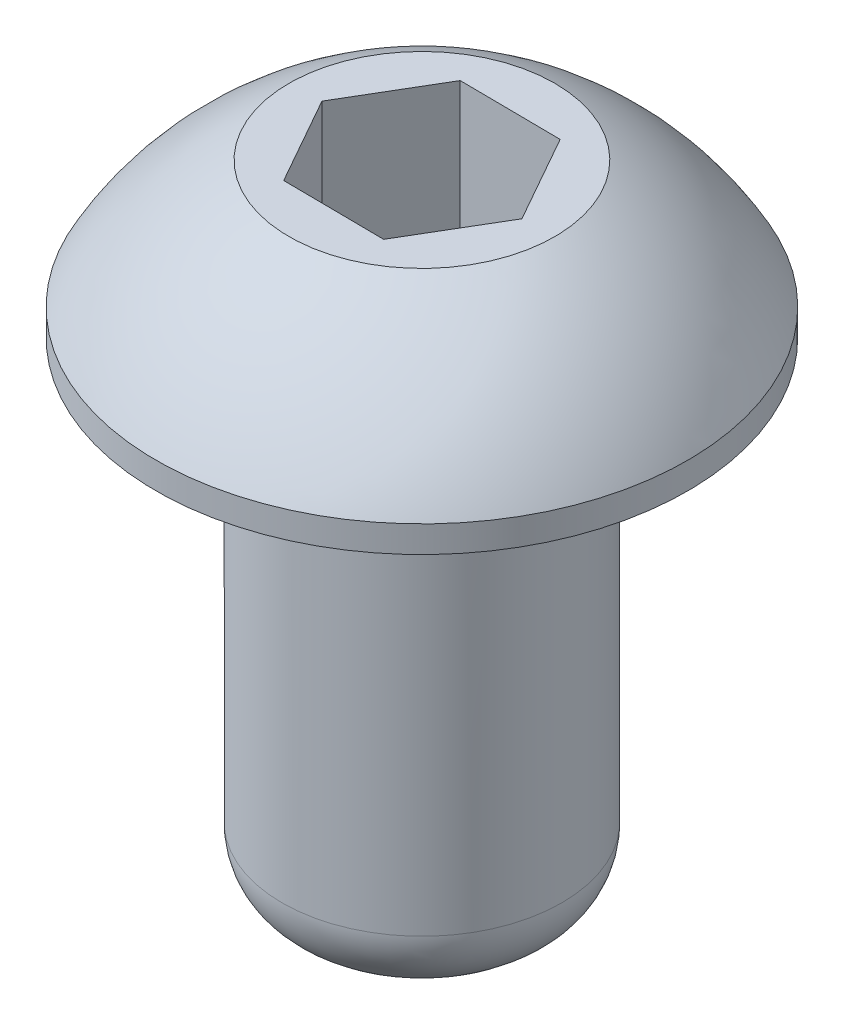
ISO-10303-21;
HEADER;
FILE_DESCRIPTION(('STEP AP214'),'2;1');
FILE_NAME('part.step','',(''),(''),'','','');
FILE_SCHEMA(('AUTOMOTIVE_DESIGN { 1 0 10303 214 1 1 1 1 }'));
ENDSEC;
DATA;
#1=APPLICATION_CONTEXT('core data for automotive mechanical design processes');
#2=APPLICATION_PROTOCOL_DEFINITION('international standard','automotive_design',2000,#1);
#3=PRODUCT_CONTEXT('',#1,'mechanical');
#4=PRODUCT('Part','Part','',(#3));
#5=PRODUCT_RELATED_PRODUCT_CATEGORY('part','',(#4));
#6=PRODUCT_DEFINITION_FORMATION('','',#4);
#7=PRODUCT_DEFINITION_CONTEXT('part definition',#1,'design');
#8=PRODUCT_DEFINITION('design','',#6,#7);
#9=PRODUCT_DEFINITION_SHAPE('','',#8);
#10=(LENGTH_UNIT() NAMED_UNIT(*) SI_UNIT(.MILLI.,.METRE.));
#11=(NAMED_UNIT(*) PLANE_ANGLE_UNIT() SI_UNIT($,.RADIAN.));
#12=(NAMED_UNIT(*) SI_UNIT($,.STERADIAN.) SOLID_ANGLE_UNIT());
#13=UNCERTAINTY_MEASURE_WITH_UNIT(LENGTH_MEASURE(1.E-05),#10,'distance_accuracy_value','');
#14=(GEOMETRIC_REPRESENTATION_CONTEXT(3) GLOBAL_UNCERTAINTY_ASSIGNED_CONTEXT((#13)) GLOBAL_UNIT_ASSIGNED_CONTEXT((#10,
#11,#12)) REPRESENTATION_CONTEXT('',''));
#15=CARTESIAN_POINT('',(0.,0.,0.));
#16=DIRECTION('',(0.,0.,1.));
#17=DIRECTION('',(1.,0.,0.));
#18=AXIS2_PLACEMENT_3D('',#15,#16,#17);
#19=CARTESIAN_POINT('',(0.,7.,0.));
#20=DIRECTION('',(0.,-1.,0.));
#21=DIRECTION('',(0.,0.,-1.));
#22=AXIS2_PLACEMENT_3D('',#19,#20,#21);
#23=CYLINDRICAL_SURFACE('',#22,2.);
#24=CARTESIAN_POINT('',(0.,6.,0.));
#25=DIRECTION('',(0.,-1.,0.));
#26=DIRECTION('',(0.,0.,-1.));
#27=AXIS2_PLACEMENT_3D('',#24,#25,#26);
#28=CIRCLE('',#27,2.);
#29=CARTESIAN_POINT('',(0.,6.,-2.));
#30=VERTEX_POINT('',#29);
#31=EDGE_CURVE('E50',#30,#30,#28,.T.);
#32=ORIENTED_EDGE('',*,*,#31,.T.);
#33=EDGE_LOOP('',(#32));
#34=FACE_BOUND('',#33,.T.);
#35=CARTESIAN_POINT('',(0.,1.,0.));
#36=DIRECTION('',(0.,1.,0.));
#37=DIRECTION('',(0.,0.,1.));
#38=AXIS2_PLACEMENT_3D('',#35,#36,#37);
#39=CIRCLE('',#38,2.);
#40=CARTESIAN_POINT('',(0.,1.,2.));
#41=VERTEX_POINT('',#40);
#42=EDGE_CURVE('E158',#41,#41,#39,.T.);
#43=ORIENTED_EDGE('',*,*,#42,.T.);
#44=EDGE_LOOP('',(#43));
#45=FACE_BOUND('',#44,.T.);
#46=ADVANCED_FACE('F39',(#34,#45),#23,.T.);
#47=CARTESIAN_POINT('',(0.,0.,0.));
#48=DIRECTION('',(0.,1.,0.));
#49=DIRECTION('',(0.,0.,1.));
#50=AXIS2_PLACEMENT_3D('',#47,#48,#49);
#51=PLANE('',#50);
#52=CARTESIAN_POINT('',(0.,0.,0.));
#53=DIRECTION('',(0.,1.,0.));
#54=DIRECTION('',(0.,0.,1.));
#55=AXIS2_PLACEMENT_3D('',#52,#53,#54);
#56=CIRCLE('',#55,1.);
#57=CARTESIAN_POINT('',(0.,0.,1.));
#58=VERTEX_POINT('',#57);
#59=EDGE_CURVE('E11',#58,#58,#56,.F.);
#60=ORIENTED_EDGE('',*,*,#59,.T.);
#61=EDGE_LOOP('',(#60));
#62=FACE_BOUND('',#61,.T.);
#63=ADVANCED_FACE('F173',(#62),#51,.F.);
#64=CARTESIAN_POINT('',(0.,7.,0.));
#65=DIRECTION('',(0.,-1.,0.));
#66=DIRECTION('',(0.,0.,-1.));
#67=AXIS2_PLACEMENT_3D('',#64,#65,#66);
#68=PLANE('',#67);
#69=CARTESIAN_POINT('',(0.,7.,0.));
#70=DIRECTION('',(0.,-1.,0.));
#71=DIRECTION('',(0.,0.,-1.));
#72=AXIS2_PLACEMENT_3D('',#69,#70,#71);
#73=CIRCLE('',#72,3.);
#74=CARTESIAN_POINT('',(0.,7.,-3.));
#75=VERTEX_POINT('',#74);
#76=EDGE_CURVE('E154',#75,#75,#73,.F.);
#77=ORIENTED_EDGE('',*,*,#76,.T.);
#78=EDGE_LOOP('',(#77));
#79=FACE_BOUND('',#78,.T.);
#80=CARTESIAN_POINT('',(0.,7.,0.));
#81=DIRECTION('',(0.,-1.,0.));
#82=DIRECTION('',(0.,0.,-1.));
#83=AXIS2_PLACEMENT_3D('',#80,#81,#82);
#84=CIRCLE('',#83,3.8);
#85=CARTESIAN_POINT('',(0.,7.,-3.8));
#86=VERTEX_POINT('',#85);
#87=EDGE_CURVE('E155',#86,#86,#84,.T.);
#88=ORIENTED_EDGE('',*,*,#87,.T.);
#89=EDGE_LOOP('',(#88));
#90=FACE_BOUND('',#89,.T.);
#91=ADVANCED_FACE('F168',(#79,#90),#68,.T.);
#92=CARTESIAN_POINT('',(0.,7.,0.));
#93=DIRECTION('',(0.,-1.,0.));
#94=DIRECTION('',(0.,0.,-1.));
#95=AXIS2_PLACEMENT_3D('',#92,#93,#94);
#96=CYLINDRICAL_SURFACE('',#95,3.8);
#97=CARTESIAN_POINT('',(0.,7.38,0.));
#98=DIRECTION('',(0.,-1.,0.));
#99=DIRECTION('',(0.,0.,-1.));
#100=AXIS2_PLACEMENT_3D('',#97,#98,#99);
#101=CIRCLE('',#100,3.8);
#102=CARTESIAN_POINT('',(0.,7.38,-3.8));
#103=VERTEX_POINT('',#102);
#104=EDGE_CURVE('E149',#103,#103,#101,.T.);
#105=ORIENTED_EDGE('',*,*,#104,.T.);
#106=EDGE_LOOP('',(#105));
#107=FACE_BOUND('',#106,.T.);
#108=ORIENTED_EDGE('',*,*,#87,.F.);
#109=EDGE_LOOP('',(#108));
#110=FACE_BOUND('',#109,.T.);
#111=ADVANCED_FACE('F175',(#107,#110),#96,.T.);
#112=CARTESIAN_POINT('',(0.,5.31849256972456,0.));
#113=DIRECTION('',(0.,-1.,0.));
#114=DIRECTION('',(0.,0.,-1.));
#115=AXIS2_PLACEMENT_3D('',#112,#113,#114);
#116=DEGENERATE_TOROIDAL_SURFACE('',#115,0.00360867205194924,4.32,.T.);
#117=CARTESIAN_POINT('',(0.,9.2,0.));
#118=DIRECTION('',(0.,-1.,0.));
#119=DIRECTION('',(0.,0.,-1.));
#120=AXIS2_PLACEMENT_3D('',#117,#118,#119);
#121=CIRCLE('',#120,1.9);
#122=CARTESIAN_POINT('',(0.,9.2,-1.9));
#123=VERTEX_POINT('',#122);
#124=EDGE_CURVE('E143',#123,#123,#121,.T.);
#125=ORIENTED_EDGE('',*,*,#124,.T.);
#126=EDGE_LOOP('',(#125));
#127=FACE_BOUND('',#126,.T.);
#128=ORIENTED_EDGE('',*,*,#104,.F.);
#129=EDGE_LOOP('',(#128));
#130=FACE_BOUND('',#129,.T.);
#131=ADVANCED_FACE('F176',(#127,#130),#116,.T.);
#132=CARTESIAN_POINT('',(0.,9.2,0.));
#133=DIRECTION('',(0.,1.,0.));
#134=DIRECTION('',(0.,0.,1.));
#135=AXIS2_PLACEMENT_3D('',#132,#133,#134);
#136=PLANE('',#135);
#137=DIRECTION('',(0.491700748351779,0.,0.870764247124502));
#138=VECTOR('',#137,1.);
#139=CARTESIAN_POINT('',(-1.44330975818268,9.2,-0.0137940301578178));
#140=LINE('',#139,#138);
#141=CARTESIAN_POINT('',(-1.44330975818268,9.2,-0.0137940301578178));
#142=VERTEX_POINT('',#141);
#143=CARTESIAN_POINT('',(-0.733600859628577,9.2,1.24304590103726));
#144=VERTEX_POINT('',#143);
#145=EDGE_CURVE('E53',#142,#144,#140,.T.);
#146=ORIENTED_EDGE('',*,*,#145,.F.);
#147=DIRECTION('',(-0.50825358454116,0.,0.861207462694711));
#148=VECTOR('',#147,1.);
#149=CARTESIAN_POINT('',(-0.709708898554099,9.2,-1.25683993119508));
#150=LINE('',#149,#148);
#151=CARTESIAN_POINT('',(-0.709708898554099,9.2,-1.25683993119508));
#152=VERTEX_POINT('',#151);
#153=EDGE_CURVE('E139',#152,#142,#150,.T.);
#154=ORIENTED_EDGE('',*,*,#153,.F.);
#155=DIRECTION('',(-0.999954332892939,0.,-0.00955678442979125));
#156=VECTOR('',#155,1.);
#157=CARTESIAN_POINT('',(0.733600859628577,9.2,-1.24304590103726));
#158=LINE('',#157,#156);
#159=CARTESIAN_POINT('',(0.733600859628577,9.2,-1.24304590103726));
#160=VERTEX_POINT('',#159);
#161=EDGE_CURVE('E132',#160,#152,#158,.T.);
#162=ORIENTED_EDGE('',*,*,#161,.F.);
#163=DIRECTION('',(-0.491700748351779,0.,-0.870764247124502));
#164=VECTOR('',#163,1.);
#165=CARTESIAN_POINT('',(1.44330975818268,9.2,0.0137940301578176));
#166=LINE('',#165,#164);
#167=CARTESIAN_POINT('',(1.44330975818268,9.2,0.0137940301578176));
#168=VERTEX_POINT('',#167);
#169=EDGE_CURVE('E105',#168,#160,#166,.T.);
#170=ORIENTED_EDGE('',*,*,#169,.F.);
#171=DIRECTION('',(0.50825358454116,0.,-0.861207462694711));
#172=VECTOR('',#171,1.);
#173=CARTESIAN_POINT('',(0.7097088985541,9.2,1.25683993119508));
#174=LINE('',#173,#172);
#175=CARTESIAN_POINT('',(0.7097088985541,9.2,1.25683993119508));
#176=VERTEX_POINT('',#175);
#177=EDGE_CURVE('E134',#176,#168,#174,.T.);
#178=ORIENTED_EDGE('',*,*,#177,.F.);
#179=DIRECTION('',(0.999954332892939,0.,0.0095567844297911));
#180=VECTOR('',#179,1.);
#181=CARTESIAN_POINT('',(-0.733600859628577,9.2,1.24304590103726));
#182=LINE('',#181,#180);
#183=EDGE_CURVE('E126',#144,#176,#182,.T.);
#184=ORIENTED_EDGE('',*,*,#183,.F.);
#185=EDGE_LOOP('',(#146,#154,#162,#170,#178,#184));
#186=FACE_BOUND('',#185,.T.);
#187=ORIENTED_EDGE('',*,*,#124,.F.);
#188=EDGE_LOOP('',(#187));
#189=FACE_BOUND('',#188,.T.);
#190=ADVANCED_FACE('F183',(#186,#189),#136,.T.);
#191=CARTESIAN_POINT('',(-1.44330975818268,7.2,-0.0137940301578178));
#192=DIRECTION('',(-0.870764247124502,0.,0.491700748351779));
#193=DIRECTION('',(0.491700748351779,0.,0.870764247124502));
#194=AXIS2_PLACEMENT_3D('',#191,#192,#193);
#195=PLANE('',#194);
#196=ORIENTED_EDGE('',*,*,#145,.T.);
#197=DIRECTION('',(0.,1.,0.));
#198=VECTOR('',#197,1.);
#199=CARTESIAN_POINT('',(-0.733600859628577,7.2,1.24304590103726));
#200=LINE('',#199,#198);
#201=CARTESIAN_POINT('',(-0.733600859628577,7.2,1.24304590103726));
#202=VERTEX_POINT('',#201);
#203=EDGE_CURVE('E81',#202,#144,#200,.T.);
#204=ORIENTED_EDGE('',*,*,#203,.F.);
#205=DIRECTION('',(0.491700748351779,0.,0.870764247124502));
#206=VECTOR('',#205,1.);
#207=CARTESIAN_POINT('',(-1.44330975818268,7.2,-0.0137940301578178));
#208=LINE('',#207,#206);
#209=CARTESIAN_POINT('',(-1.44330975818268,7.2,-0.0137940301578178));
#210=VERTEX_POINT('',#209);
#211=EDGE_CURVE('E136',#210,#202,#208,.T.);
#212=ORIENTED_EDGE('',*,*,#211,.F.);
#213=DIRECTION('',(0.,1.,0.));
#214=VECTOR('',#213,1.);
#215=CARTESIAN_POINT('',(-1.44330975818268,7.2,-0.0137940301578178));
#216=LINE('',#215,#214);
#217=EDGE_CURVE('E61',#210,#142,#216,.T.);
#218=ORIENTED_EDGE('',*,*,#217,.T.);
#219=EDGE_LOOP('',(#196,#204,#212,#218));
#220=FACE_BOUND('',#219,.T.);
#221=ADVANCED_FACE('F239',(#220),#195,.F.);
#222=CARTESIAN_POINT('',(-0.709708898554099,7.2,-1.25683993119508));
#223=DIRECTION('',(-0.861207462694711,0.,-0.50825358454116));
#224=DIRECTION('',(-0.50825358454116,0.,0.861207462694711));
#225=AXIS2_PLACEMENT_3D('',#222,#223,#224);
#226=PLANE('',#225);
#227=ORIENTED_EDGE('',*,*,#153,.T.);
#228=ORIENTED_EDGE('',*,*,#217,.F.);
#229=DIRECTION('',(-0.50825358454116,0.,0.861207462694711));
#230=VECTOR('',#229,1.);
#231=CARTESIAN_POINT('',(-0.709708898554099,7.2,-1.25683993119508));
#232=LINE('',#231,#230);
#233=CARTESIAN_POINT('',(-0.709708898554099,7.2,-1.25683993119508));
#234=VERTEX_POINT('',#233);
#235=EDGE_CURVE('E111',#234,#210,#232,.T.);
#236=ORIENTED_EDGE('',*,*,#235,.F.);
#237=DIRECTION('',(0.,1.,0.));
#238=VECTOR('',#237,1.);
#239=CARTESIAN_POINT('',(-0.709708898554099,7.2,-1.25683993119508));
#240=LINE('',#239,#238);
#241=EDGE_CURVE('E106',#234,#152,#240,.T.);
#242=ORIENTED_EDGE('',*,*,#241,.T.);
#243=EDGE_LOOP('',(#227,#228,#236,#242));
#244=FACE_BOUND('',#243,.T.);
#245=ADVANCED_FACE('F246',(#244),#226,.F.);
#246=CARTESIAN_POINT('',(0.733600859628577,7.2,-1.24304590103726));
#247=DIRECTION('',(0.00955678442979125,0.,-0.999954332892939));
#248=DIRECTION('',(-0.999954332892939,0.,-0.00955678442979125));
#249=AXIS2_PLACEMENT_3D('',#246,#247,#248);
#250=PLANE('',#249);
#251=ORIENTED_EDGE('',*,*,#161,.T.);
#252=ORIENTED_EDGE('',*,*,#241,.F.);
#253=DIRECTION('',(-0.999954332892939,0.,-0.00955678442979125));
#254=VECTOR('',#253,1.);
#255=CARTESIAN_POINT('',(0.733600859628577,7.2,-1.24304590103726));
#256=LINE('',#255,#254);
#257=CARTESIAN_POINT('',(0.733600859628577,7.2,-1.24304590103726));
#258=VERTEX_POINT('',#257);
#259=EDGE_CURVE('E109',#258,#234,#256,.T.);
#260=ORIENTED_EDGE('',*,*,#259,.F.);
#261=DIRECTION('',(0.,1.,0.));
#262=VECTOR('',#261,1.);
#263=CARTESIAN_POINT('',(0.733600859628577,7.2,-1.24304590103726));
#264=LINE('',#263,#262);
#265=EDGE_CURVE('E92',#258,#160,#264,.T.);
#266=ORIENTED_EDGE('',*,*,#265,.T.);
#267=EDGE_LOOP('',(#251,#252,#260,#266));
#268=FACE_BOUND('',#267,.T.);
#269=ADVANCED_FACE('F112',(#268),#250,.F.);
#270=CARTESIAN_POINT('',(1.44330975818268,7.2,0.0137940301578176));
#271=DIRECTION('',(0.870764247124502,0.,-0.491700748351779));
#272=DIRECTION('',(-0.491700748351779,0.,-0.870764247124502));
#273=AXIS2_PLACEMENT_3D('',#270,#271,#272);
#274=PLANE('',#273);
#275=ORIENTED_EDGE('',*,*,#169,.T.);
#276=ORIENTED_EDGE('',*,*,#265,.F.);
#277=DIRECTION('',(-0.491700748351779,0.,-0.870764247124502));
#278=VECTOR('',#277,1.);
#279=CARTESIAN_POINT('',(1.44330975818268,7.2,0.0137940301578176));
#280=LINE('',#279,#278);
#281=CARTESIAN_POINT('',(1.44330975818268,7.2,0.0137940301578176));
#282=VERTEX_POINT('',#281);
#283=EDGE_CURVE('E97',#282,#258,#280,.T.);
#284=ORIENTED_EDGE('',*,*,#283,.F.);
#285=DIRECTION('',(0.,1.,0.));
#286=VECTOR('',#285,1.);
#287=CARTESIAN_POINT('',(1.44330975818268,7.2,0.0137940301578176));
#288=LINE('',#287,#286);
#289=EDGE_CURVE('E110',#282,#168,#288,.T.);
#290=ORIENTED_EDGE('',*,*,#289,.T.);
#291=EDGE_LOOP('',(#275,#276,#284,#290));
#292=FACE_BOUND('',#291,.T.);
#293=ADVANCED_FACE('F100',(#292),#274,.F.);
#294=CARTESIAN_POINT('',(0.7097088985541,7.2,1.25683993119508));
#295=DIRECTION('',(0.861207462694711,0.,0.50825358454116));
#296=DIRECTION('',(0.50825358454116,0.,-0.861207462694711));
#297=AXIS2_PLACEMENT_3D('',#294,#295,#296);
#298=PLANE('',#297);
#299=ORIENTED_EDGE('',*,*,#177,.T.);
#300=ORIENTED_EDGE('',*,*,#289,.F.);
#301=DIRECTION('',(0.50825358454116,0.,-0.861207462694711));
#302=VECTOR('',#301,1.);
#303=CARTESIAN_POINT('',(0.7097088985541,7.2,1.25683993119508));
#304=LINE('',#303,#302);
#305=CARTESIAN_POINT('',(0.7097088985541,7.2,1.25683993119508));
#306=VERTEX_POINT('',#305);
#307=EDGE_CURVE('E117',#306,#282,#304,.T.);
#308=ORIENTED_EDGE('',*,*,#307,.F.);
#309=DIRECTION('',(0.,1.,0.));
#310=VECTOR('',#309,1.);
#311=CARTESIAN_POINT('',(0.7097088985541,7.2,1.25683993119508));
#312=LINE('',#311,#310);
#313=EDGE_CURVE('E145',#306,#176,#312,.T.);
#314=ORIENTED_EDGE('',*,*,#313,.T.);
#315=EDGE_LOOP('',(#299,#300,#308,#314));
#316=FACE_BOUND('',#315,.T.);
#317=ADVANCED_FACE('F273',(#316),#298,.F.);
#318=CARTESIAN_POINT('',(-0.733600859628577,7.2,1.24304590103726));
#319=DIRECTION('',(-0.0095567844297911,0.,0.999954332892939));
#320=DIRECTION('',(0.999954332892939,0.,0.0095567844297911));
#321=AXIS2_PLACEMENT_3D('',#318,#319,#320);
#322=PLANE('',#321);
#323=ORIENTED_EDGE('',*,*,#183,.T.);
#324=ORIENTED_EDGE('',*,*,#313,.F.);
#325=DIRECTION('',(0.999954332892939,0.,0.0095567844297911));
#326=VECTOR('',#325,1.);
#327=CARTESIAN_POINT('',(-0.733600859628577,7.2,1.24304590103726));
#328=LINE('',#327,#326);
#329=EDGE_CURVE('E124',#202,#306,#328,.T.);
#330=ORIENTED_EDGE('',*,*,#329,.F.);
#331=ORIENTED_EDGE('',*,*,#203,.T.);
#332=EDGE_LOOP('',(#323,#324,#330,#331));
#333=FACE_BOUND('',#332,.T.);
#334=ADVANCED_FACE('F285',(#333),#322,.F.);
#335=CARTESIAN_POINT('',(0.,7.2,0.));
#336=DIRECTION('',(0.,1.,0.));
#337=DIRECTION('',(0.,0.,1.));
#338=AXIS2_PLACEMENT_3D('',#335,#336,#337);
#339=PLANE('',#338);
#340=ORIENTED_EDGE('',*,*,#211,.T.);
#341=ORIENTED_EDGE('',*,*,#329,.T.);
#342=ORIENTED_EDGE('',*,*,#307,.T.);
#343=ORIENTED_EDGE('',*,*,#283,.T.);
#344=ORIENTED_EDGE('',*,*,#259,.T.);
#345=ORIENTED_EDGE('',*,*,#235,.T.);
#346=EDGE_LOOP('',(#340,#341,#342,#343,#344,#345));
#347=FACE_BOUND('',#346,.T.);
#348=ADVANCED_FACE('F116',(#347),#339,.T.);
#349=CARTESIAN_POINT('',(0.,6.,0.));
#350=DIRECTION('',(0.,-1.,0.));
#351=DIRECTION('',(0.,0.,-1.));
#352=AXIS2_PLACEMENT_3D('',#349,#350,#351);
#353=TOROIDAL_SURFACE('',#352,3.,1.);
#354=ORIENTED_EDGE('',*,*,#31,.F.);
#355=EDGE_LOOP('',(#354));
#356=FACE_BOUND('',#355,.T.);
#357=ORIENTED_EDGE('',*,*,#76,.F.);
#358=EDGE_LOOP('',(#357));
#359=FACE_BOUND('',#358,.T.);
#360=ADVANCED_FACE('F164',(#356,#359),#353,.F.);
#361=CARTESIAN_POINT('',(0.,1.,0.));
#362=DIRECTION('',(0.,1.,0.));
#363=DIRECTION('',(0.,0.,1.));
#364=AXIS2_PLACEMENT_3D('',#361,#362,#363);
#365=DEGENERATE_TOROIDAL_SURFACE('',#364,1.,1.,.T.);
#366=ORIENTED_EDGE('',*,*,#59,.F.);
#367=EDGE_LOOP('',(#366));
#368=FACE_BOUND('',#367,.T.);
#369=ORIENTED_EDGE('',*,*,#42,.F.);
#370=EDGE_LOOP('',(#369));
#371=FACE_BOUND('',#370,.T.);
#372=ADVANCED_FACE('F41',(#368,#371),#365,.T.);
#373=CLOSED_SHELL('',(#46,#63,#91,#111,#131,#190,#221,#245,#269,#293,#317,#334,#348,#360,#372));
#374=MANIFOLD_SOLID_BREP('B2',#373);
#375=ADVANCED_BREP_SHAPE_REPRESENTATION('',(#18,#374),#14);
#376=SHAPE_DEFINITION_REPRESENTATION(#9,#375);
ENDSEC;
END-ISO-10303-21;
